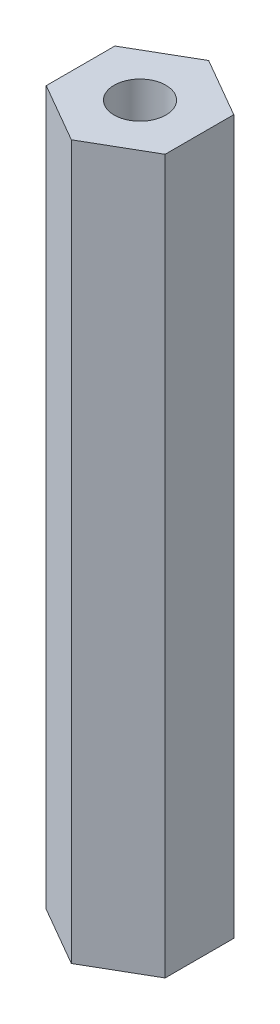
ISO-10303-21;
HEADER;
FILE_DESCRIPTION(('STEP AP214'),'2;1');
FILE_NAME('part.step','',(''),(''),'','','');
FILE_SCHEMA(('AUTOMOTIVE_DESIGN { 1 0 10303 214 1 1 1 1 }'));
ENDSEC;
DATA;
#1=APPLICATION_CONTEXT('core data for automotive mechanical design processes');
#2=APPLICATION_PROTOCOL_DEFINITION('international standard','automotive_design',2000,#1);
#3=PRODUCT_CONTEXT('',#1,'mechanical');
#4=PRODUCT('Part','Part','',(#3));
#5=PRODUCT_RELATED_PRODUCT_CATEGORY('part','',(#4));
#6=PRODUCT_DEFINITION_FORMATION('','',#4);
#7=PRODUCT_DEFINITION_CONTEXT('part definition',#1,'design');
#8=PRODUCT_DEFINITION('design','',#6,#7);
#9=PRODUCT_DEFINITION_SHAPE('','',#8);
#10=(LENGTH_UNIT() NAMED_UNIT(*) SI_UNIT(.MILLI.,.METRE.));
#11=(NAMED_UNIT(*) PLANE_ANGLE_UNIT() SI_UNIT($,.RADIAN.));
#12=(NAMED_UNIT(*) SI_UNIT($,.STERADIAN.) SOLID_ANGLE_UNIT());
#13=UNCERTAINTY_MEASURE_WITH_UNIT(LENGTH_MEASURE(1.E-05),#10,'distance_accuracy_value','');
#14=(GEOMETRIC_REPRESENTATION_CONTEXT(3) GLOBAL_UNCERTAINTY_ASSIGNED_CONTEXT((#13)) GLOBAL_UNIT_ASSIGNED_CONTEXT((#10,
#11,#12)) REPRESENTATION_CONTEXT('',''));
#15=CARTESIAN_POINT('',(0.,0.,0.));
#16=DIRECTION('',(0.,0.,1.));
#17=DIRECTION('',(1.,0.,0.));
#18=AXIS2_PLACEMENT_3D('',#15,#16,#17);
#19=CARTESIAN_POINT('',(3.96874999999999,47.625,-2.29135888084634));
#20=DIRECTION('',(-0.5,0.,0.866025403784439));
#21=DIRECTION('',(0.866025403784439,0.,0.5));
#22=AXIS2_PLACEMENT_3D('',#19,#20,#21);
#23=PLANE('',#22);
#24=DIRECTION('',(-0.866025403784439,0.,-0.5));
#25=VECTOR('',#24,1.);
#26=CARTESIAN_POINT('',(3.96874999999999,0.,-2.29135888084634));
#27=LINE('',#26,#25);
#28=CARTESIAN_POINT('',(3.96874999999999,0.,-2.29135888084634));
#29=VERTEX_POINT('',#28);
#30=CARTESIAN_POINT('',(0.,0.,-4.58271776169267));
#31=VERTEX_POINT('',#30);
#32=EDGE_CURVE('E118',#29,#31,#27,.T.);
#33=ORIENTED_EDGE('',*,*,#32,.T.);
#34=DIRECTION('',(0.,-1.,0.));
#35=VECTOR('',#34,1.);
#36=CARTESIAN_POINT('',(0.,47.625,-4.58271776169267));
#37=LINE('',#36,#35);
#38=CARTESIAN_POINT('',(0.,47.625,-4.58271776169267));
#39=VERTEX_POINT('',#38);
#40=EDGE_CURVE('E11',#39,#31,#37,.T.);
#41=ORIENTED_EDGE('',*,*,#40,.F.);
#42=DIRECTION('',(-0.866025403784439,0.,-0.5));
#43=VECTOR('',#42,1.);
#44=CARTESIAN_POINT('',(3.96874999999999,47.625,-2.29135888084634));
#45=LINE('',#44,#43);
#46=CARTESIAN_POINT('',(3.96874999999999,47.625,-2.29135888084634));
#47=VERTEX_POINT('',#46);
#48=EDGE_CURVE('E129',#47,#39,#45,.T.);
#49=ORIENTED_EDGE('',*,*,#48,.F.);
#50=DIRECTION('',(0.,-1.,0.));
#51=VECTOR('',#50,1.);
#52=CARTESIAN_POINT('',(3.96874999999999,47.625,-2.29135888084634));
#53=LINE('',#52,#51);
#54=EDGE_CURVE('E114',#47,#29,#53,.T.);
#55=ORIENTED_EDGE('',*,*,#54,.T.);
#56=EDGE_LOOP('',(#33,#41,#49,#55));
#57=FACE_BOUND('',#56,.T.);
#58=ADVANCED_FACE('F34',(#57),#23,.F.);
#59=CARTESIAN_POINT('',(0.,47.625,-4.58271776169267));
#60=DIRECTION('',(0.500000000000001,0.,0.866025403784438));
#61=DIRECTION('',(0.866025403784438,0.,-0.500000000000001));
#62=AXIS2_PLACEMENT_3D('',#59,#60,#61);
#63=PLANE('',#62);
#64=DIRECTION('',(-0.866025403784438,0.,0.500000000000001));
#65=VECTOR('',#64,1.);
#66=CARTESIAN_POINT('',(0.,0.,-4.58271776169267));
#67=LINE('',#66,#65);
#68=CARTESIAN_POINT('',(-3.96875,0.,-2.29135888084633));
#69=VERTEX_POINT('',#68);
#70=EDGE_CURVE('E121',#31,#69,#67,.T.);
#71=ORIENTED_EDGE('',*,*,#70,.T.);
#72=DIRECTION('',(0.,-1.,0.));
#73=VECTOR('',#72,1.);
#74=CARTESIAN_POINT('',(-3.96875,47.625,-2.29135888084633));
#75=LINE('',#74,#73);
#76=CARTESIAN_POINT('',(-3.96875,47.625,-2.29135888084633));
#77=VERTEX_POINT('',#76);
#78=EDGE_CURVE('E42',#77,#69,#75,.T.);
#79=ORIENTED_EDGE('',*,*,#78,.F.);
#80=DIRECTION('',(-0.866025403784438,0.,0.500000000000001));
#81=VECTOR('',#80,1.);
#82=CARTESIAN_POINT('',(0.,47.625,-4.58271776169267));
#83=LINE('',#82,#81);
#84=EDGE_CURVE('E87',#39,#77,#83,.T.);
#85=ORIENTED_EDGE('',*,*,#84,.F.);
#86=ORIENTED_EDGE('',*,*,#40,.T.);
#87=EDGE_LOOP('',(#71,#79,#85,#86));
#88=FACE_BOUND('',#87,.T.);
#89=ADVANCED_FACE('F154',(#88),#63,.F.);
#90=CARTESIAN_POINT('',(-3.96875,47.625,-2.29135888084633));
#91=DIRECTION('',(1.,0.,0.));
#92=DIRECTION('',(0.,0.,-1.));
#93=AXIS2_PLACEMENT_3D('',#90,#91,#92);
#94=PLANE('',#93);
#95=DIRECTION('',(0.,0.,1.));
#96=VECTOR('',#95,1.);
#97=CARTESIAN_POINT('',(-3.96875,0.,-2.29135888084633));
#98=LINE('',#97,#96);
#99=CARTESIAN_POINT('',(-3.96875000000001,0.,2.29135888084634));
#100=VERTEX_POINT('',#99);
#101=EDGE_CURVE('E124',#69,#100,#98,.T.);
#102=ORIENTED_EDGE('',*,*,#101,.T.);
#103=DIRECTION('',(0.,-1.,0.));
#104=VECTOR('',#103,1.);
#105=CARTESIAN_POINT('',(-3.96875000000001,47.625,2.29135888084634));
#106=LINE('',#105,#104);
#107=CARTESIAN_POINT('',(-3.96875000000001,47.625,2.29135888084634));
#108=VERTEX_POINT('',#107);
#109=EDGE_CURVE('E109',#108,#100,#106,.T.);
#110=ORIENTED_EDGE('',*,*,#109,.F.);
#111=DIRECTION('',(0.,0.,1.));
#112=VECTOR('',#111,1.);
#113=CARTESIAN_POINT('',(-3.96875,47.625,-2.29135888084633));
#114=LINE('',#113,#112);
#115=EDGE_CURVE('E100',#77,#108,#114,.T.);
#116=ORIENTED_EDGE('',*,*,#115,.F.);
#117=ORIENTED_EDGE('',*,*,#78,.T.);
#118=EDGE_LOOP('',(#102,#110,#116,#117));
#119=FACE_BOUND('',#118,.T.);
#120=ADVANCED_FACE('F135',(#119),#94,.F.);
#121=CARTESIAN_POINT('',(-3.96875000000001,47.625,2.29135888084634));
#122=DIRECTION('',(0.500000000000001,0.,-0.866025403784438));
#123=DIRECTION('',(-0.866025403784438,0.,-0.500000000000001));
#124=AXIS2_PLACEMENT_3D('',#121,#122,#123);
#125=PLANE('',#124);
#126=DIRECTION('',(0.866025403784438,0.,0.500000000000001));
#127=VECTOR('',#126,1.);
#128=CARTESIAN_POINT('',(-3.96875000000001,0.,2.29135888084634));
#129=LINE('',#128,#127);
#130=CARTESIAN_POINT('',(0.,0.,4.58271776169267));
#131=VERTEX_POINT('',#130);
#132=EDGE_CURVE('E108',#100,#131,#129,.T.);
#133=ORIENTED_EDGE('',*,*,#132,.T.);
#134=DIRECTION('',(0.,-1.,0.));
#135=VECTOR('',#134,1.);
#136=CARTESIAN_POINT('',(0.,47.625,4.58271776169267));
#137=LINE('',#136,#135);
#138=CARTESIAN_POINT('',(0.,47.625,4.58271776169267));
#139=VERTEX_POINT('',#138);
#140=EDGE_CURVE('E105',#139,#131,#137,.T.);
#141=ORIENTED_EDGE('',*,*,#140,.F.);
#142=DIRECTION('',(0.866025403784438,0.,0.500000000000001));
#143=VECTOR('',#142,1.);
#144=CARTESIAN_POINT('',(-3.96875000000001,47.625,2.29135888084634));
#145=LINE('',#144,#143);
#146=EDGE_CURVE('E94',#108,#139,#145,.T.);
#147=ORIENTED_EDGE('',*,*,#146,.F.);
#148=ORIENTED_EDGE('',*,*,#109,.T.);
#149=EDGE_LOOP('',(#133,#141,#147,#148));
#150=FACE_BOUND('',#149,.T.);
#151=ADVANCED_FACE('F106',(#150),#125,.F.);
#152=CARTESIAN_POINT('',(0.,47.625,4.58271776169267));
#153=DIRECTION('',(-0.5,0.,-0.866025403784439));
#154=DIRECTION('',(-0.866025403784439,0.,0.5));
#155=AXIS2_PLACEMENT_3D('',#152,#153,#154);
#156=PLANE('',#155);
#157=DIRECTION('',(0.866025403784439,0.,-0.5));
#158=VECTOR('',#157,1.);
#159=CARTESIAN_POINT('',(0.,0.,4.58271776169267));
#160=LINE('',#159,#158);
#161=CARTESIAN_POINT('',(3.96874999999999,0.,2.29135888084634));
#162=VERTEX_POINT('',#161);
#163=EDGE_CURVE('E73',#131,#162,#160,.T.);
#164=ORIENTED_EDGE('',*,*,#163,.T.);
#165=DIRECTION('',(0.,-1.,0.));
#166=VECTOR('',#165,1.);
#167=CARTESIAN_POINT('',(3.96874999999999,47.625,2.29135888084634));
#168=LINE('',#167,#166);
#169=CARTESIAN_POINT('',(3.96874999999999,47.625,2.29135888084634));
#170=VERTEX_POINT('',#169);
#171=EDGE_CURVE('E110',#170,#162,#168,.T.);
#172=ORIENTED_EDGE('',*,*,#171,.F.);
#173=DIRECTION('',(0.866025403784439,0.,-0.5));
#174=VECTOR('',#173,1.);
#175=CARTESIAN_POINT('',(0.,47.625,4.58271776169267));
#176=LINE('',#175,#174);
#177=EDGE_CURVE('E98',#139,#170,#176,.T.);
#178=ORIENTED_EDGE('',*,*,#177,.F.);
#179=ORIENTED_EDGE('',*,*,#140,.T.);
#180=EDGE_LOOP('',(#164,#172,#178,#179));
#181=FACE_BOUND('',#180,.T.);
#182=ADVANCED_FACE('F112',(#181),#156,.F.);
#183=CARTESIAN_POINT('',(3.96874999999999,47.625,2.29135888084634));
#184=DIRECTION('',(-1.,0.,0.));
#185=DIRECTION('',(0.,0.,1.));
#186=AXIS2_PLACEMENT_3D('',#183,#184,#185);
#187=PLANE('',#186);
#188=DIRECTION('',(0.,0.,-1.));
#189=VECTOR('',#188,1.);
#190=CARTESIAN_POINT('',(3.96874999999999,0.,2.29135888084634));
#191=LINE('',#190,#189);
#192=EDGE_CURVE('E79',#162,#29,#191,.T.);
#193=ORIENTED_EDGE('',*,*,#192,.T.);
#194=ORIENTED_EDGE('',*,*,#54,.F.);
#195=DIRECTION('',(0.,0.,-1.));
#196=VECTOR('',#195,1.);
#197=CARTESIAN_POINT('',(3.96874999999999,47.625,2.29135888084634));
#198=LINE('',#197,#196);
#199=EDGE_CURVE('E50',#170,#47,#198,.T.);
#200=ORIENTED_EDGE('',*,*,#199,.F.);
#201=ORIENTED_EDGE('',*,*,#171,.T.);
#202=EDGE_LOOP('',(#193,#194,#200,#201));
#203=FACE_BOUND('',#202,.T.);
#204=ADVANCED_FACE('F142',(#203),#187,.F.);
#205=CARTESIAN_POINT('',(0.,47.625,-4.58271776169267));
#206=DIRECTION('',(0.,1.,0.));
#207=DIRECTION('',(0.,0.,1.));
#208=AXIS2_PLACEMENT_3D('',#205,#206,#207);
#209=PLANE('',#208);
#210=CARTESIAN_POINT('',(0.,47.625,0.));
#211=DIRECTION('',(0.,1.,0.));
#212=DIRECTION('',(0.,0.,1.));
#213=AXIS2_PLACEMENT_3D('',#210,#211,#212);
#214=CIRCLE('',#213,1.72719999999999);
#215=CARTESIAN_POINT('',(0.,47.625,1.72719999999999));
#216=VERTEX_POINT('',#215);
#217=EDGE_CURVE('E211',#216,#216,#214,.T.);
#218=ORIENTED_EDGE('',*,*,#217,.F.);
#219=EDGE_LOOP('',(#218));
#220=FACE_BOUND('',#219,.T.);
#221=ORIENTED_EDGE('',*,*,#48,.T.);
#222=ORIENTED_EDGE('',*,*,#84,.T.);
#223=ORIENTED_EDGE('',*,*,#115,.T.);
#224=ORIENTED_EDGE('',*,*,#146,.T.);
#225=ORIENTED_EDGE('',*,*,#177,.T.);
#226=ORIENTED_EDGE('',*,*,#199,.T.);
#227=EDGE_LOOP('',(#221,#222,#223,#224,#225,#226));
#228=FACE_BOUND('',#227,.T.);
#229=ADVANCED_FACE('F96',(#220,#228),#209,.T.);
#230=CARTESIAN_POINT('',(0.,0.,-4.58271776169267));
#231=DIRECTION('',(0.,1.,0.));
#232=DIRECTION('',(0.,0.,1.));
#233=AXIS2_PLACEMENT_3D('',#230,#231,#232);
#234=PLANE('',#233);
#235=CARTESIAN_POINT('',(0.,0.,0.));
#236=DIRECTION('',(0.,1.,0.));
#237=DIRECTION('',(0.,0.,1.));
#238=AXIS2_PLACEMENT_3D('',#235,#236,#237);
#239=CIRCLE('',#238,1.72719999999999);
#240=CARTESIAN_POINT('',(0.,0.,1.72719999999999));
#241=VERTEX_POINT('',#240);
#242=EDGE_CURVE('E122',#241,#241,#239,.T.);
#243=ORIENTED_EDGE('',*,*,#242,.T.);
#244=EDGE_LOOP('',(#243));
#245=FACE_BOUND('',#244,.T.);
#246=ORIENTED_EDGE('',*,*,#32,.F.);
#247=ORIENTED_EDGE('',*,*,#192,.F.);
#248=ORIENTED_EDGE('',*,*,#163,.F.);
#249=ORIENTED_EDGE('',*,*,#132,.F.);
#250=ORIENTED_EDGE('',*,*,#101,.F.);
#251=ORIENTED_EDGE('',*,*,#70,.F.);
#252=EDGE_LOOP('',(#246,#247,#248,#249,#250,#251));
#253=FACE_BOUND('',#252,.T.);
#254=ADVANCED_FACE('F138',(#245,#253),#234,.F.);
#255=CARTESIAN_POINT('',(0.,47.625,0.));
#256=DIRECTION('',(0.,1.,0.));
#257=DIRECTION('',(0.,0.,1.));
#258=AXIS2_PLACEMENT_3D('',#255,#256,#257);
#259=CYLINDRICAL_SURFACE('',#258,1.72719999999999);
#260=ORIENTED_EDGE('',*,*,#242,.F.);
#261=EDGE_LOOP('',(#260));
#262=FACE_BOUND('',#261,.T.);
#263=ORIENTED_EDGE('',*,*,#217,.T.);
#264=EDGE_LOOP('',(#263));
#265=FACE_BOUND('',#264,.T.);
#266=ADVANCED_FACE('F191',(#262,#265),#259,.F.);
#267=CLOSED_SHELL('',(#58,#89,#120,#151,#182,#204,#229,#254,#266));
#268=MANIFOLD_SOLID_BREP('B2',#267);
#269=ADVANCED_BREP_SHAPE_REPRESENTATION('',(#18,#268),#14);
#270=SHAPE_DEFINITION_REPRESENTATION(#9,#269);
ENDSEC;
END-ISO-10303-21;
